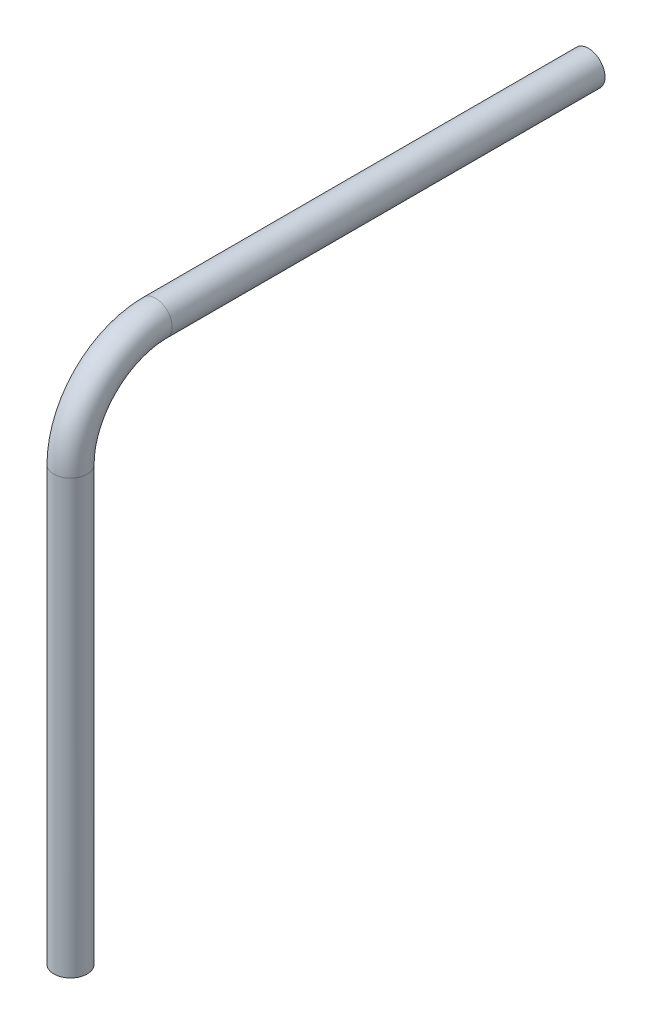
ISO-10303-21;
HEADER;
FILE_DESCRIPTION(('STEP AP214'),'2;1');
FILE_NAME('part.step','',(''),(''),'','','');
FILE_SCHEMA(('AUTOMOTIVE_DESIGN { 1 0 10303 214 1 1 1 1 }'));
ENDSEC;
DATA;
#1=APPLICATION_CONTEXT('core data for automotive mechanical design processes');
#2=APPLICATION_PROTOCOL_DEFINITION('international standard','automotive_design',2000,#1);
#3=PRODUCT_CONTEXT('',#1,'mechanical');
#4=PRODUCT('Part','Part','',(#3));
#5=PRODUCT_RELATED_PRODUCT_CATEGORY('part','',(#4));
#6=PRODUCT_DEFINITION_FORMATION('','',#4);
#7=PRODUCT_DEFINITION_CONTEXT('part definition',#1,'design');
#8=PRODUCT_DEFINITION('design','',#6,#7);
#9=PRODUCT_DEFINITION_SHAPE('','',#8);
#10=(LENGTH_UNIT() NAMED_UNIT(*) SI_UNIT(.MILLI.,.METRE.));
#11=(NAMED_UNIT(*) PLANE_ANGLE_UNIT() SI_UNIT($,.RADIAN.));
#12=(NAMED_UNIT(*) SI_UNIT($,.STERADIAN.) SOLID_ANGLE_UNIT());
#13=UNCERTAINTY_MEASURE_WITH_UNIT(LENGTH_MEASURE(1.E-05),#10,'distance_accuracy_value','');
#14=(GEOMETRIC_REPRESENTATION_CONTEXT(3) GLOBAL_UNCERTAINTY_ASSIGNED_CONTEXT((#13)) GLOBAL_UNIT_ASSIGNED_CONTEXT((#10,
#11,#12)) REPRESENTATION_CONTEXT('',''));
#15=CARTESIAN_POINT('',(0.,0.,0.));
#16=DIRECTION('',(0.,0.,1.));
#17=DIRECTION('',(1.,0.,0.));
#18=AXIS2_PLACEMENT_3D('',#15,#16,#17);
#19=CARTESIAN_POINT('',(0.,0.,0.));
#20=DIRECTION('',(-1.,0.,0.));
#21=DIRECTION('',(0.,0.,1.));
#22=AXIS2_PLACEMENT_3D('',#19,#20,#21);
#23=TOROIDAL_SURFACE('',#22,64.833774641659,12.7);
#24=CARTESIAN_POINT('',(0.,64.833774641659,0.));
#25=DIRECTION('',(0.,0.,-1.));
#26=DIRECTION('',(0.,1.,0.));
#27=AXIS2_PLACEMENT_3D('',#24,#25,#26);
#28=CIRCLE('',#27,12.7);
#29=CARTESIAN_POINT('',(0.,77.533774641659,0.));
#30=VERTEX_POINT('',#29);
#31=EDGE_CURVE('E126',#30,#30,#28,.T.);
#32=ORIENTED_EDGE('',*,*,#31,.F.);
#33=EDGE_LOOP('',(#32));
#34=FACE_BOUND('',#33,.T.);
#35=CARTESIAN_POINT('',(0.,0.,64.833774641659));
#36=DIRECTION('',(0.,-1.,0.));
#37=DIRECTION('',(0.,0.,-1.));
#38=AXIS2_PLACEMENT_3D('',#35,#36,#37);
#39=CIRCLE('',#38,12.7);
#40=CARTESIAN_POINT('',(-11.6673683045636,0.,69.85));
#41=VERTEX_POINT('',#40);
#42=CARTESIAN_POINT('',(-10.1118547881285,0.,57.15));
#43=VERTEX_POINT('',#42);
#44=EDGE_CURVE('E62',#41,#43,#39,.T.);
#45=ORIENTED_EDGE('',*,*,#44,.F.);
#46=EDGE_CURVE('E121',#43,#41,#39,.T.);
#47=ORIENTED_EDGE('',*,*,#46,.F.);
#48=EDGE_LOOP('',(#45,#47));
#49=FACE_BOUND('',#48,.T.);
#50=ADVANCED_FACE('F39',(#34,#49),#23,.T.);
#51=CARTESIAN_POINT('',(0.,-330.2,64.833774641659));
#52=DIRECTION('',(0.,1.,0.));
#53=DIRECTION('',(0.,0.,1.));
#54=AXIS2_PLACEMENT_3D('',#51,#52,#53);
#55=CYLINDRICAL_SURFACE('',#54,12.7);
#56=CARTESIAN_POINT('',(0.,-330.2,64.833774641659));
#57=DIRECTION('',(0.,-1.,0.));
#58=DIRECTION('',(0.,0.,-1.));
#59=AXIS2_PLACEMENT_3D('',#56,#57,#58);
#60=CIRCLE('',#59,12.7);
#61=CARTESIAN_POINT('',(0.,-330.2,52.133774641659));
#62=VERTEX_POINT('',#61);
#63=EDGE_CURVE('E122',#62,#62,#60,.T.);
#64=ORIENTED_EDGE('',*,*,#63,.F.);
#65=EDGE_LOOP('',(#64));
#66=FACE_BOUND('',#65,.T.);
#67=ORIENTED_EDGE('',*,*,#46,.T.);
#68=DIRECTION('',(0.,1.,0.));
#69=VECTOR('',#68,1.);
#70=CARTESIAN_POINT('',(-11.6673683045636,-330.2,69.8500000000001));
#71=LINE('',#70,#69);
#72=CARTESIAN_POINT('',(-11.6673683045636,-152.4,69.8500000000001));
#73=VERTEX_POINT('',#72);
#74=EDGE_CURVE('E11',#41,#73,#71,.F.);
#75=ORIENTED_EDGE('',*,*,#74,.T.);
#76=CARTESIAN_POINT('',(0.,-152.4,64.833774641659));
#77=DIRECTION('',(0.,-1.,0.));
#78=DIRECTION('',(0.,0.,-1.));
#79=AXIS2_PLACEMENT_3D('',#76,#77,#78);
#80=CIRCLE('',#79,12.7);
#81=CARTESIAN_POINT('',(-10.1118547881285,-152.4,57.15));
#82=VERTEX_POINT('',#81);
#83=EDGE_CURVE('E132',#73,#82,#80,.T.);
#84=ORIENTED_EDGE('',*,*,#83,.T.);
#85=DIRECTION('',(0.,1.,0.));
#86=VECTOR('',#85,1.);
#87=CARTESIAN_POINT('',(-10.1118547881286,-330.2,57.1500000000001));
#88=LINE('',#87,#86);
#89=EDGE_CURVE('E47',#82,#43,#88,.T.);
#90=ORIENTED_EDGE('',*,*,#89,.T.);
#91=EDGE_LOOP('',(#67,#75,#84,#90));
#92=FACE_BOUND('',#91,.T.);
#93=ADVANCED_FACE('F138',(#66,#92),#55,.T.);
#94=CARTESIAN_POINT('',(0.,-330.2,64.833774641659));
#95=DIRECTION('',(0.,-1.,0.));
#96=DIRECTION('',(0.,0.,-1.));
#97=AXIS2_PLACEMENT_3D('',#94,#95,#96);
#98=PLANE('',#97);
#99=ORIENTED_EDGE('',*,*,#63,.T.);
#100=EDGE_LOOP('',(#99));
#101=FACE_BOUND('',#100,.T.);
#102=ADVANCED_FACE('F146',(#101),#98,.T.);
#103=CARTESIAN_POINT('',(0.,64.833774641659,-330.2));
#104=DIRECTION('',(0.,0.,1.));
#105=DIRECTION('',(0.,-1.,0.));
#106=AXIS2_PLACEMENT_3D('',#103,#104,#105);
#107=CYLINDRICAL_SURFACE('',#106,12.7);
#108=CARTESIAN_POINT('',(0.,64.833774641659,-330.2));
#109=DIRECTION('',(0.,0.,-1.));
#110=DIRECTION('',(0.,1.,0.));
#111=AXIS2_PLACEMENT_3D('',#108,#109,#110);
#112=CIRCLE('',#111,12.7);
#113=CARTESIAN_POINT('',(0.,77.533774641659,-330.2));
#114=VERTEX_POINT('',#113);
#115=EDGE_CURVE('E112',#114,#114,#112,.T.);
#116=ORIENTED_EDGE('',*,*,#115,.F.);
#117=EDGE_LOOP('',(#116));
#118=FACE_BOUND('',#117,.T.);
#119=ORIENTED_EDGE('',*,*,#31,.T.);
#120=EDGE_LOOP('',(#119));
#121=FACE_BOUND('',#120,.T.);
#122=ADVANCED_FACE('F150',(#118,#121),#107,.T.);
#123=CARTESIAN_POINT('',(0.,64.833774641659,-330.2));
#124=DIRECTION('',(0.,0.,-1.));
#125=DIRECTION('',(0.,1.,0.));
#126=AXIS2_PLACEMENT_3D('',#123,#124,#125);
#127=PLANE('',#126);
#128=ORIENTED_EDGE('',*,*,#115,.T.);
#129=EDGE_LOOP('',(#128));
#130=FACE_BOUND('',#129,.T.);
#131=ADVANCED_FACE('F152',(#130),#127,.T.);
#132=CARTESIAN_POINT('',(-6.35,-152.4,57.15));
#133=DIRECTION('',(0.,0.,-1.));
#134=DIRECTION('',(0.,1.,0.));
#135=AXIS2_PLACEMENT_3D('',#132,#133,#134);
#136=PLANE('',#135);
#137=DIRECTION('',(-1.,0.,0.));
#138=VECTOR('',#137,1.);
#139=CARTESIAN_POINT('',(-6.35,-152.4,57.15));
#140=LINE('',#139,#138);
#141=CARTESIAN_POINT('',(-6.35,-152.4,57.15));
#142=VERTEX_POINT('',#141);
#143=EDGE_CURVE('E54',#142,#82,#140,.T.);
#144=ORIENTED_EDGE('',*,*,#143,.F.);
#145=DIRECTION('',(0.,-1.,0.));
#146=VECTOR('',#145,1.);
#147=CARTESIAN_POINT('',(-6.35,-152.4,57.15));
#148=LINE('',#147,#146);
#149=CARTESIAN_POINT('',(-6.35,0.,57.15));
#150=VERTEX_POINT('',#149);
#151=EDGE_CURVE('E82',#150,#142,#148,.T.);
#152=ORIENTED_EDGE('',*,*,#151,.F.);
#153=DIRECTION('',(-1.,0.,0.));
#154=VECTOR('',#153,1.);
#155=CARTESIAN_POINT('',(-6.35,0.,57.15));
#156=LINE('',#155,#154);
#157=EDGE_CURVE('E109',#150,#43,#156,.T.);
#158=ORIENTED_EDGE('',*,*,#157,.T.);
#159=ORIENTED_EDGE('',*,*,#89,.F.);
#160=EDGE_LOOP('',(#144,#152,#158,#159));
#161=FACE_BOUND('',#160,.T.);
#162=ADVANCED_FACE('F80',(#161),#136,.F.);
#163=CARTESIAN_POINT('',(-6.35,0.,57.15));
#164=DIRECTION('',(0.,1.,0.));
#165=DIRECTION('',(0.,0.,1.));
#166=AXIS2_PLACEMENT_3D('',#163,#164,#165);
#167=PLANE('',#166);
#168=ORIENTED_EDGE('',*,*,#157,.F.);
#169=DIRECTION('',(0.,0.,-1.));
#170=VECTOR('',#169,1.);
#171=CARTESIAN_POINT('',(-6.35,0.,57.15));
#172=LINE('',#171,#170);
#173=CARTESIAN_POINT('',(-6.35,0.,69.85));
#174=VERTEX_POINT('',#173);
#175=EDGE_CURVE('E88',#174,#150,#172,.T.);
#176=ORIENTED_EDGE('',*,*,#175,.F.);
#177=DIRECTION('',(-1.,0.,0.));
#178=VECTOR('',#177,1.);
#179=CARTESIAN_POINT('',(-6.35,0.,69.85));
#180=LINE('',#179,#178);
#181=EDGE_CURVE('E113',#174,#41,#180,.T.);
#182=ORIENTED_EDGE('',*,*,#181,.T.);
#183=ORIENTED_EDGE('',*,*,#44,.T.);
#184=EDGE_LOOP('',(#168,#176,#182,#183));
#185=FACE_BOUND('',#184,.T.);
#186=ADVANCED_FACE('F167',(#185),#167,.F.);
#187=CARTESIAN_POINT('',(-6.35,-152.4,69.8500000000001));
#188=DIRECTION('',(0.,0.,1.));
#189=DIRECTION('',(0.,-1.,0.));
#190=AXIS2_PLACEMENT_3D('',#187,#188,#189);
#191=PLANE('',#190);
#192=ORIENTED_EDGE('',*,*,#181,.F.);
#193=DIRECTION('',(0.,1.,0.));
#194=VECTOR('',#193,1.);
#195=CARTESIAN_POINT('',(-6.35,-152.4,69.8500000000001));
#196=LINE('',#195,#194);
#197=CARTESIAN_POINT('',(-6.35,-152.4,69.8500000000001));
#198=VERTEX_POINT('',#197);
#199=EDGE_CURVE('E98',#198,#174,#196,.T.);
#200=ORIENTED_EDGE('',*,*,#199,.F.);
#201=DIRECTION('',(-1.,0.,0.));
#202=VECTOR('',#201,1.);
#203=CARTESIAN_POINT('',(-6.35,-152.4,69.8500000000001));
#204=LINE('',#203,#202);
#205=EDGE_CURVE('E87',#198,#73,#204,.T.);
#206=ORIENTED_EDGE('',*,*,#205,.T.);
#207=ORIENTED_EDGE('',*,*,#74,.F.);
#208=EDGE_LOOP('',(#192,#200,#206,#207));
#209=FACE_BOUND('',#208,.T.);
#210=ADVANCED_FACE('F170',(#209),#191,.F.);
#211=CARTESIAN_POINT('',(-6.35,-152.4,57.15));
#212=DIRECTION('',(0.,-1.,0.));
#213=DIRECTION('',(0.,0.,-1.));
#214=AXIS2_PLACEMENT_3D('',#211,#212,#213);
#215=PLANE('',#214);
#216=ORIENTED_EDGE('',*,*,#205,.F.);
#217=DIRECTION('',(0.,0.,1.));
#218=VECTOR('',#217,1.);
#219=CARTESIAN_POINT('',(-6.35,-152.4,57.15));
#220=LINE('',#219,#218);
#221=EDGE_CURVE('E91',#142,#198,#220,.T.);
#222=ORIENTED_EDGE('',*,*,#221,.F.);
#223=ORIENTED_EDGE('',*,*,#143,.T.);
#224=ORIENTED_EDGE('',*,*,#83,.F.);
#225=EDGE_LOOP('',(#216,#222,#223,#224));
#226=FACE_BOUND('',#225,.T.);
#227=ADVANCED_FACE('F92',(#226),#215,.F.);
#228=CARTESIAN_POINT('',(-6.35,0.,0.));
#229=DIRECTION('',(1.,0.,0.));
#230=DIRECTION('',(0.,0.,-1.));
#231=AXIS2_PLACEMENT_3D('',#228,#229,#230);
#232=PLANE('',#231);
#233=ORIENTED_EDGE('',*,*,#151,.T.);
#234=ORIENTED_EDGE('',*,*,#221,.T.);
#235=ORIENTED_EDGE('',*,*,#199,.T.);
#236=ORIENTED_EDGE('',*,*,#175,.T.);
#237=EDGE_LOOP('',(#233,#234,#235,#236));
#238=FACE_BOUND('',#237,.T.);
#239=ADVANCED_FACE('F100',(#238),#232,.F.);
#240=CLOSED_SHELL('',(#50,#93,#102,#122,#131,#162,#186,#210,#227,#239));
#241=MANIFOLD_SOLID_BREP('B2',#240);
#242=ADVANCED_BREP_SHAPE_REPRESENTATION('',(#18,#241),#14);
#243=SHAPE_DEFINITION_REPRESENTATION(#9,#242);
ENDSEC;
END-ISO-10303-21;
